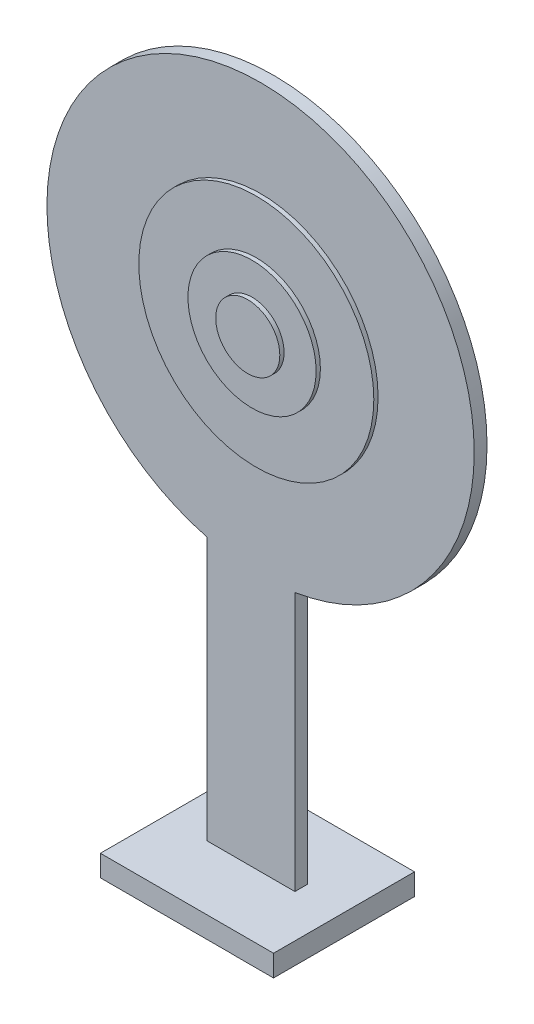
ISO-10303-21;
HEADER;
FILE_DESCRIPTION(('STEP AP214'),'2;1');
FILE_NAME('part.step','',(''),(''),'','','');
FILE_SCHEMA(('AUTOMOTIVE_DESIGN { 1 0 10303 214 1 1 1 1 }'));
ENDSEC;
DATA;
#1=APPLICATION_CONTEXT('core data for automotive mechanical design processes');
#2=APPLICATION_PROTOCOL_DEFINITION('international standard','automotive_design',2000,#1);
#3=PRODUCT_CONTEXT('',#1,'mechanical');
#4=PRODUCT('Part','Part','',(#3));
#5=PRODUCT_RELATED_PRODUCT_CATEGORY('part','',(#4));
#6=PRODUCT_DEFINITION_FORMATION('','',#4);
#7=PRODUCT_DEFINITION_CONTEXT('part definition',#1,'design');
#8=PRODUCT_DEFINITION('design','',#6,#7);
#9=PRODUCT_DEFINITION_SHAPE('','',#8);
#10=(LENGTH_UNIT() NAMED_UNIT(*) SI_UNIT(.MILLI.,.METRE.));
#11=(NAMED_UNIT(*) PLANE_ANGLE_UNIT() SI_UNIT($,.RADIAN.));
#12=(NAMED_UNIT(*) SI_UNIT($,.STERADIAN.) SOLID_ANGLE_UNIT());
#13=UNCERTAINTY_MEASURE_WITH_UNIT(LENGTH_MEASURE(1.E-05),#10,'distance_accuracy_value','');
#14=(GEOMETRIC_REPRESENTATION_CONTEXT(3) GLOBAL_UNCERTAINTY_ASSIGNED_CONTEXT((#13)) GLOBAL_UNIT_ASSIGNED_CONTEXT((#10,
#11,#12)) REPRESENTATION_CONTEXT('',''));
#15=CARTESIAN_POINT('',(0.,0.,0.));
#16=DIRECTION('',(0.,0.,1.));
#17=DIRECTION('',(1.,0.,0.));
#18=AXIS2_PLACEMENT_3D('',#15,#16,#17);
#19=CARTESIAN_POINT('',(-12.4918570683324,0.,0.));
#20=DIRECTION('',(1.,0.,0.));
#21=DIRECTION('',(0.,0.,-1.));
#22=AXIS2_PLACEMENT_3D('',#19,#20,#21);
#23=PLANE('',#22);
#24=DIRECTION('',(0.,0.,1.));
#25=VECTOR('',#24,1.);
#26=CARTESIAN_POINT('',(-12.4918570683324,-114.948734013118,-15.));
#27=LINE('',#26,#25);
#28=CARTESIAN_POINT('',(-12.4918570683324,-114.948734013118,-15.));
#29=VERTEX_POINT('',#28);
#30=CARTESIAN_POINT('',(-12.4918570683324,-114.948734013118,0.));
#31=VERTEX_POINT('',#30);
#32=EDGE_CURVE('E582',#29,#31,#27,.T.);
#33=ORIENTED_EDGE('',*,*,#32,.F.);
#34=DIRECTION('',(0.,1.,0.));
#35=VECTOR('',#34,1.);
#36=CARTESIAN_POINT('',(-12.4918570683324,-114.96458114681,-15.));
#37=LINE('',#36,#35);
#38=CARTESIAN_POINT('',(-12.4918570683324,-114.96458114681,-15.));
#39=VERTEX_POINT('',#38);
#40=EDGE_CURVE('E183',#39,#29,#37,.T.);
#41=ORIENTED_EDGE('',*,*,#40,.F.);
#42=DIRECTION('',(0.,0.,-1.));
#43=VECTOR('',#42,1.);
#44=CARTESIAN_POINT('',(-12.4918570683324,-114.96458114681,0.));
#45=LINE('',#44,#43);
#46=CARTESIAN_POINT('',(-12.4918570683324,-114.96458114681,0.));
#47=VERTEX_POINT('',#46);
#48=EDGE_CURVE('E240',#47,#39,#45,.T.);
#49=ORIENTED_EDGE('',*,*,#48,.F.);
#50=DIRECTION('',(0.,-1.,0.));
#51=VECTOR('',#50,1.);
#52=CARTESIAN_POINT('',(-12.4918570683324,-114.96458114681,0.));
#53=LINE('',#52,#51);
#54=EDGE_CURVE('E244',#31,#47,#53,.T.);
#55=ORIENTED_EDGE('',*,*,#54,.F.);
#56=EDGE_LOOP('',(#33,#41,#49,#55));
#57=FACE_BOUND('',#56,.T.);
#58=ADVANCED_FACE('F39',(#57),#23,.F.);
#59=CARTESIAN_POINT('',(-12.5218570683324,-114.96458114681,3.));
#60=DIRECTION('',(0.,0.,-1.));
#61=DIRECTION('',(0.,1.,0.));
#62=AXIS2_PLACEMENT_3D('',#59,#60,#61);
#63=PLANE('',#62);
#64=DIRECTION('',(0.,1.,0.));
#65=VECTOR('',#64,1.);
#66=CARTESIAN_POINT('',(-12.5218570683324,-114.96458114681,3.));
#67=LINE('',#66,#65);
#68=CARTESIAN_POINT('',(-12.5218570683324,-114.96458114681,3.));
#69=VERTEX_POINT('',#68);
#70=CARTESIAN_POINT('',(-12.5218570683324,-114.948734013118,3.));
#71=VERTEX_POINT('',#70);
#72=EDGE_CURVE('E223',#69,#71,#67,.T.);
#73=ORIENTED_EDGE('',*,*,#72,.T.);
#74=DIRECTION('',(1.,0.,0.));
#75=VECTOR('',#74,1.);
#76=CARTESIAN_POINT('',(-12.5218570683324,-114.948734013118,3.));
#77=LINE('',#76,#75);
#78=CARTESIAN_POINT('',(-12.4918570683324,-114.948734013118,3.));
#79=VERTEX_POINT('',#78);
#80=EDGE_CURVE('E184',#71,#79,#77,.T.);
#81=ORIENTED_EDGE('',*,*,#80,.T.);
#82=DIRECTION('',(0.,1.,0.));
#83=VECTOR('',#82,1.);
#84=CARTESIAN_POINT('',(-12.4918570683324,-114.96458114681,3.));
#85=LINE('',#84,#83);
#86=CARTESIAN_POINT('',(-12.4918570683324,-109.96458114681,3.));
#87=VERTEX_POINT('',#86);
#88=EDGE_CURVE('E187',#79,#87,#85,.T.);
#89=ORIENTED_EDGE('',*,*,#88,.T.);
#90=DIRECTION('',(1.,0.,0.));
#91=VECTOR('',#90,1.);
#92=CARTESIAN_POINT('',(-12.5218570683324,-109.96458114681,3.));
#93=LINE('',#92,#91);
#94=CARTESIAN_POINT('',(-12.4911301481857,-109.96458114681,3.));
#95=VERTEX_POINT('',#94);
#96=EDGE_CURVE('E54',#87,#95,#93,.T.);
#97=ORIENTED_EDGE('',*,*,#96,.T.);
#98=DIRECTION('',(0.,1.,0.));
#99=VECTOR('',#98,1.);
#100=CARTESIAN_POINT('',(-12.4911301481857,-48.4145811468104,2.99999999999999));
#101=LINE('',#100,#99);
#102=CARTESIAN_POINT('',(-12.4911301481857,-114.96458114681,3.));
#103=VERTEX_POINT('',#102);
#104=EDGE_CURVE('E232',#103,#95,#101,.T.);
#105=ORIENTED_EDGE('',*,*,#104,.F.);
#106=DIRECTION('',(1.,0.,0.));
#107=VECTOR('',#106,1.);
#108=CARTESIAN_POINT('',(-12.5218570683324,-114.96458114681,3.));
#109=LINE('',#108,#107);
#110=EDGE_CURVE('E228',#69,#103,#109,.T.);
#111=ORIENTED_EDGE('',*,*,#110,.F.);
#112=EDGE_LOOP('',(#73,#81,#89,#97,#105,#111));
#113=FACE_BOUND('',#112,.T.);
#114=ADVANCED_FACE('F327',(#113),#63,.T.);
#115=CARTESIAN_POINT('',(-12.5218570683324,0.,0.));
#116=DIRECTION('',(-1.,0.,0.));
#117=DIRECTION('',(0.,0.,1.));
#118=AXIS2_PLACEMENT_3D('',#115,#116,#117);
#119=PLANE('',#118);
#120=DIRECTION('',(0.,-1.,0.));
#121=VECTOR('',#120,1.);
#122=CARTESIAN_POINT('',(-12.5218570683324,-114.96458114681,18.));
#123=LINE('',#122,#121);
#124=CARTESIAN_POINT('',(-12.5218570683324,-114.948734013118,18.));
#125=VERTEX_POINT('',#124);
#126=CARTESIAN_POINT('',(-12.5218570683324,-114.96458114681,18.));
#127=VERTEX_POINT('',#126);
#128=EDGE_CURVE('E226',#125,#127,#123,.T.);
#129=ORIENTED_EDGE('',*,*,#128,.F.);
#130=DIRECTION('',(0.,0.,-1.));
#131=VECTOR('',#130,1.);
#132=CARTESIAN_POINT('',(-12.5218570683324,-114.948734013118,0.));
#133=LINE('',#132,#131);
#134=EDGE_CURVE('E11',#125,#71,#133,.T.);
#135=ORIENTED_EDGE('',*,*,#134,.T.);
#136=ORIENTED_EDGE('',*,*,#72,.F.);
#137=DIRECTION('',(0.,0.,-1.));
#138=VECTOR('',#137,1.);
#139=CARTESIAN_POINT('',(-12.5218570683324,-114.96458114681,3.));
#140=LINE('',#139,#138);
#141=EDGE_CURVE('E220',#127,#69,#140,.T.);
#142=ORIENTED_EDGE('',*,*,#141,.F.);
#143=EDGE_LOOP('',(#129,#135,#136,#142));
#144=FACE_BOUND('',#143,.T.);
#145=ADVANCED_FACE('F320',(#144),#119,.T.);
#146=CARTESIAN_POINT('',(8.02814293166765,-114.96458114681,3.));
#147=DIRECTION('',(-1.,0.,0.));
#148=DIRECTION('',(0.,0.,1.));
#149=AXIS2_PLACEMENT_3D('',#146,#147,#148);
#150=PLANE('',#149);
#151=DIRECTION('',(0.,0.,1.));
#152=VECTOR('',#151,1.);
#153=CARTESIAN_POINT('',(8.02814293166765,-109.96458114681,18.));
#154=LINE('',#153,#152);
#155=CARTESIAN_POINT('',(8.02814293166765,-109.96458114681,0.));
#156=VERTEX_POINT('',#155);
#157=CARTESIAN_POINT('',(8.02814293166765,-109.96458114681,3.));
#158=VERTEX_POINT('',#157);
#159=EDGE_CURVE('E198',#156,#158,#154,.T.);
#160=ORIENTED_EDGE('',*,*,#159,.F.);
#161=DIRECTION('',(0.,1.,0.));
#162=VECTOR('',#161,1.);
#163=CARTESIAN_POINT('',(8.02814293166765,-114.96458114681,0.));
#164=LINE('',#163,#162);
#165=CARTESIAN_POINT('',(8.02814293166765,-49.35128084527,0.));
#166=VERTEX_POINT('',#165);
#167=EDGE_CURVE('E263',#156,#166,#164,.T.);
#168=ORIENTED_EDGE('',*,*,#167,.T.);
#169=DIRECTION('',(0.,0.,-1.));
#170=VECTOR('',#169,1.);
#171=CARTESIAN_POINT('',(8.02814293166765,-49.35128084527,3.));
#172=LINE('',#171,#170);
#173=CARTESIAN_POINT('',(8.02814293166765,-49.35128084527,3.));
#174=VERTEX_POINT('',#173);
#175=EDGE_CURVE('E265',#174,#166,#172,.T.);
#176=ORIENTED_EDGE('',*,*,#175,.F.);
#177=DIRECTION('',(0.,1.,0.));
#178=VECTOR('',#177,1.);
#179=CARTESIAN_POINT('',(8.02814293166765,-114.96458114681,3.));
#180=LINE('',#179,#178);
#181=EDGE_CURVE('E262',#158,#174,#180,.T.);
#182=ORIENTED_EDGE('',*,*,#181,.F.);
#183=EDGE_LOOP('',(#160,#168,#176,#182));
#184=FACE_BOUND('',#183,.T.);
#185=ADVANCED_FACE('F318',(#184),#150,.F.);
#186=CARTESIAN_POINT('',(0.,0.,0.));
#187=DIRECTION('',(0.,0.,1.));
#188=DIRECTION('',(1.,0.,0.));
#189=AXIS2_PLACEMENT_3D('',#186,#187,#188);
#190=PLANE('',#189);
#191=DIRECTION('',(1.,0.,0.));
#192=VECTOR('',#191,1.);
#193=CARTESIAN_POINT('',(-12.4918570683324,-109.96458114681,0.));
#194=LINE('',#193,#192);
#195=CARTESIAN_POINT('',(-12.4911301481857,-109.96458114681,0.));
#196=VERTEX_POINT('',#195);
#197=EDGE_CURVE('E47',#196,#156,#194,.T.);
#198=ORIENTED_EDGE('',*,*,#197,.F.);
#199=DIRECTION('',(0.,-1.,0.));
#200=VECTOR('',#199,1.);
#201=CARTESIAN_POINT('',(-12.4911301481857,-48.4145811468104,0.));
#202=LINE('',#201,#200);
#203=CARTESIAN_POINT('',(-12.4911301481857,-48.4145811468104,0.));
#204=VERTEX_POINT('',#203);
#205=EDGE_CURVE('E266',#204,#196,#202,.T.);
#206=ORIENTED_EDGE('',*,*,#205,.F.);
#207=CARTESIAN_POINT('',(0.,0.,0.));
#208=DIRECTION('',(0.,0.,1.));
#209=DIRECTION('',(1.,0.,0.));
#210=AXIS2_PLACEMENT_3D('',#207,#208,#209);
#211=CIRCLE('',#210,50.);
#212=EDGE_CURVE('E296',#166,#204,#211,.T.);
#213=ORIENTED_EDGE('',*,*,#212,.F.);
#214=ORIENTED_EDGE('',*,*,#167,.F.);
#215=EDGE_LOOP('',(#198,#206,#213,#214));
#216=FACE_BOUND('',#215,.T.);
#217=ADVANCED_FACE('F305',(#216),#190,.F.);
#218=CARTESIAN_POINT('',(0.,0.,3.));
#219=DIRECTION('',(0.,0.,-1.));
#220=DIRECTION('',(-1.,0.,0.));
#221=AXIS2_PLACEMENT_3D('',#218,#219,#220);
#222=CYLINDRICAL_SURFACE('',#221,50.);
#223=DIRECTION('',(0.,0.,-1.));
#224=VECTOR('',#223,1.);
#225=CARTESIAN_POINT('',(-12.4911301481857,-48.4145811468104,3.));
#226=LINE('',#225,#224);
#227=CARTESIAN_POINT('',(-12.4911301481857,-48.4145811468104,3.));
#228=VERTEX_POINT('',#227);
#229=EDGE_CURVE('E277',#228,#204,#226,.T.);
#230=ORIENTED_EDGE('',*,*,#229,.F.);
#231=CARTESIAN_POINT('',(0.,0.,3.));
#232=DIRECTION('',(0.,0.,1.));
#233=DIRECTION('',(1.,0.,0.));
#234=AXIS2_PLACEMENT_3D('',#231,#232,#233);
#235=CIRCLE('',#234,50.);
#236=EDGE_CURVE('E299',#174,#228,#235,.T.);
#237=ORIENTED_EDGE('',*,*,#236,.F.);
#238=ORIENTED_EDGE('',*,*,#175,.T.);
#239=ORIENTED_EDGE('',*,*,#212,.T.);
#240=EDGE_LOOP('',(#230,#237,#238,#239));
#241=FACE_BOUND('',#240,.T.);
#242=ADVANCED_FACE('F41',(#241),#222,.T.);
#243=CARTESIAN_POINT('',(0.,0.,3.));
#244=DIRECTION('',(0.,0.,1.));
#245=DIRECTION('',(1.,0.,0.));
#246=AXIS2_PLACEMENT_3D('',#243,#244,#245);
#247=PLANE('',#246);
#248=EDGE_CURVE('E236',#95,#158,#93,.T.);
#249=ORIENTED_EDGE('',*,*,#248,.T.);
#250=ORIENTED_EDGE('',*,*,#181,.T.);
#251=ORIENTED_EDGE('',*,*,#236,.T.);
#252=DIRECTION('',(0.,-1.,0.));
#253=VECTOR('',#252,1.);
#254=CARTESIAN_POINT('',(-12.4911301481857,-48.4145811468104,3.));
#255=LINE('',#254,#253);
#256=EDGE_CURVE('E259',#228,#95,#255,.T.);
#257=ORIENTED_EDGE('',*,*,#256,.T.);
#258=EDGE_LOOP('',(#249,#250,#251,#257));
#259=FACE_BOUND('',#258,.T.);
#260=CARTESIAN_POINT('',(0.,0.,3.));
#261=DIRECTION('',(0.,0.,1.));
#262=DIRECTION('',(1.,0.,0.));
#263=AXIS2_PLACEMENT_3D('',#260,#261,#262);
#264=CIRCLE('',#263,27.5);
#265=CARTESIAN_POINT('',(27.5,0.,3.));
#266=VERTEX_POINT('',#265);
#267=EDGE_CURVE('E293',#266,#266,#264,.T.);
#268=ORIENTED_EDGE('',*,*,#267,.F.);
#269=EDGE_LOOP('',(#268));
#270=FACE_BOUND('',#269,.T.);
#271=ADVANCED_FACE('F313',(#259,#270),#247,.T.);
#272=CARTESIAN_POINT('',(0.,0.,4.));
#273=DIRECTION('',(0.,0.,-1.));
#274=DIRECTION('',(-1.,0.,0.));
#275=AXIS2_PLACEMENT_3D('',#272,#273,#274);
#276=CYLINDRICAL_SURFACE('',#275,27.5);
#277=CARTESIAN_POINT('',(0.,0.,4.));
#278=DIRECTION('',(0.,0.,1.));
#279=DIRECTION('',(1.,0.,0.));
#280=AXIS2_PLACEMENT_3D('',#277,#278,#279);
#281=CIRCLE('',#280,27.5);
#282=CARTESIAN_POINT('',(27.5,0.,4.));
#283=VERTEX_POINT('',#282);
#284=EDGE_CURVE('E290',#283,#283,#281,.T.);
#285=ORIENTED_EDGE('',*,*,#284,.F.);
#286=EDGE_LOOP('',(#285));
#287=FACE_BOUND('',#286,.T.);
#288=ORIENTED_EDGE('',*,*,#267,.T.);
#289=EDGE_LOOP('',(#288));
#290=FACE_BOUND('',#289,.T.);
#291=ADVANCED_FACE('F528',(#287,#290),#276,.T.);
#292=CARTESIAN_POINT('',(0.,0.,4.));
#293=DIRECTION('',(0.,0.,1.));
#294=DIRECTION('',(1.,0.,0.));
#295=AXIS2_PLACEMENT_3D('',#292,#293,#294);
#296=PLANE('',#295);
#297=CARTESIAN_POINT('',(0.,0.,4.));
#298=DIRECTION('',(0.,0.,1.));
#299=DIRECTION('',(1.,0.,0.));
#300=AXIS2_PLACEMENT_3D('',#297,#298,#299);
#301=CIRCLE('',#300,15.);
#302=CARTESIAN_POINT('',(15.,0.,4.));
#303=VERTEX_POINT('',#302);
#304=EDGE_CURVE('E287',#303,#303,#301,.T.);
#305=ORIENTED_EDGE('',*,*,#304,.F.);
#306=EDGE_LOOP('',(#305));
#307=FACE_BOUND('',#306,.T.);
#308=ORIENTED_EDGE('',*,*,#284,.T.);
#309=EDGE_LOOP('',(#308));
#310=FACE_BOUND('',#309,.T.);
#311=ADVANCED_FACE('F519',(#307,#310),#296,.T.);
#312=CARTESIAN_POINT('',(0.,0.,5.));
#313=DIRECTION('',(0.,0.,-1.));
#314=DIRECTION('',(-1.,0.,0.));
#315=AXIS2_PLACEMENT_3D('',#312,#313,#314);
#316=CYLINDRICAL_SURFACE('',#315,15.);
#317=CARTESIAN_POINT('',(0.,0.,5.));
#318=DIRECTION('',(0.,0.,1.));
#319=DIRECTION('',(1.,0.,0.));
#320=AXIS2_PLACEMENT_3D('',#317,#318,#319);
#321=CIRCLE('',#320,15.);
#322=CARTESIAN_POINT('',(15.,0.,5.));
#323=VERTEX_POINT('',#322);
#324=EDGE_CURVE('E283',#323,#323,#321,.T.);
#325=ORIENTED_EDGE('',*,*,#324,.F.);
#326=EDGE_LOOP('',(#325));
#327=FACE_BOUND('',#326,.T.);
#328=ORIENTED_EDGE('',*,*,#304,.T.);
#329=EDGE_LOOP('',(#328));
#330=FACE_BOUND('',#329,.T.);
#331=ADVANCED_FACE('F510',(#327,#330),#316,.T.);
#332=CARTESIAN_POINT('',(0.,0.,5.));
#333=DIRECTION('',(0.,0.,1.));
#334=DIRECTION('',(1.,0.,0.));
#335=AXIS2_PLACEMENT_3D('',#332,#333,#334);
#336=PLANE('',#335);
#337=CARTESIAN_POINT('',(0.,0.,5.));
#338=DIRECTION('',(0.,0.,1.));
#339=DIRECTION('',(1.,0.,0.));
#340=AXIS2_PLACEMENT_3D('',#337,#338,#339);
#341=CIRCLE('',#340,7.5);
#342=CARTESIAN_POINT('',(7.5,0.,5.));
#343=VERTEX_POINT('',#342);
#344=EDGE_CURVE('E284',#343,#343,#341,.T.);
#345=ORIENTED_EDGE('',*,*,#344,.F.);
#346=EDGE_LOOP('',(#345));
#347=FACE_BOUND('',#346,.T.);
#348=ORIENTED_EDGE('',*,*,#324,.T.);
#349=EDGE_LOOP('',(#348));
#350=FACE_BOUND('',#349,.T.);
#351=ADVANCED_FACE('F501',(#347,#350),#336,.T.);
#352=CARTESIAN_POINT('',(0.,0.,6.));
#353=DIRECTION('',(0.,0.,-1.));
#354=DIRECTION('',(-1.,0.,0.));
#355=AXIS2_PLACEMENT_3D('',#352,#353,#354);
#356=CYLINDRICAL_SURFACE('',#355,7.5);
#357=CARTESIAN_POINT('',(0.,0.,6.));
#358=DIRECTION('',(0.,0.,1.));
#359=DIRECTION('',(1.,0.,0.));
#360=AXIS2_PLACEMENT_3D('',#357,#358,#359);
#361=CIRCLE('',#360,7.5);
#362=CARTESIAN_POINT('',(7.5,0.,6.));
#363=VERTEX_POINT('',#362);
#364=EDGE_CURVE('E280',#363,#363,#361,.T.);
#365=ORIENTED_EDGE('',*,*,#364,.F.);
#366=EDGE_LOOP('',(#365));
#367=FACE_BOUND('',#366,.T.);
#368=ORIENTED_EDGE('',*,*,#344,.T.);
#369=EDGE_LOOP('',(#368));
#370=FACE_BOUND('',#369,.T.);
#371=ADVANCED_FACE('F492',(#367,#370),#356,.T.);
#372=CARTESIAN_POINT('',(0.,0.,6.));
#373=DIRECTION('',(0.,0.,1.));
#374=DIRECTION('',(1.,0.,0.));
#375=AXIS2_PLACEMENT_3D('',#372,#373,#374);
#376=PLANE('',#375);
#377=ORIENTED_EDGE('',*,*,#364,.T.);
#378=EDGE_LOOP('',(#377));
#379=FACE_BOUND('',#378,.T.);
#380=ADVANCED_FACE('F476',(#379),#376,.T.);
#381=CARTESIAN_POINT('',(-12.4911301481857,-48.4145811468104,3.));
#382=DIRECTION('',(1.,0.,0.));
#383=DIRECTION('',(0.,1.,0.));
#384=AXIS2_PLACEMENT_3D('',#381,#382,#383);
#385=PLANE('',#384);
#386=ORIENTED_EDGE('',*,*,#205,.T.);
#387=CARTESIAN_POINT('',(-12.4911301481857,-114.96458114681,0.));
#388=VERTEX_POINT('',#387);
#389=EDGE_CURVE('E252',#196,#388,#202,.T.);
#390=ORIENTED_EDGE('',*,*,#389,.T.);
#391=DIRECTION('',(0.,0.,-1.));
#392=VECTOR('',#391,1.);
#393=CARTESIAN_POINT('',(-12.4911301481857,-114.96458114681,3.));
#394=LINE('',#393,#392);
#395=EDGE_CURVE('E274',#103,#388,#394,.T.);
#396=ORIENTED_EDGE('',*,*,#395,.F.);
#397=ORIENTED_EDGE('',*,*,#104,.T.);
#398=ORIENTED_EDGE('',*,*,#256,.F.);
#399=ORIENTED_EDGE('',*,*,#229,.T.);
#400=EDGE_LOOP('',(#386,#390,#396,#397,#398,#399));
#401=FACE_BOUND('',#400,.T.);
#402=ADVANCED_FACE('F309',(#401),#385,.F.);
#403=CARTESIAN_POINT('',(-12.4911301481857,-114.96458114681,3.));
#404=DIRECTION('',(0.,1.,0.));
#405=DIRECTION('',(0.,0.,1.));
#406=AXIS2_PLACEMENT_3D('',#403,#404,#405);
#407=PLANE('',#406);
#408=ORIENTED_EDGE('',*,*,#395,.T.);
#409=DIRECTION('',(1.,0.,0.));
#410=VECTOR('',#409,1.);
#411=CARTESIAN_POINT('',(-12.4918570683324,-114.96458114681,0.));
#412=LINE('',#411,#410);
#413=EDGE_CURVE('E249',#47,#388,#412,.T.);
#414=ORIENTED_EDGE('',*,*,#413,.F.);
#415=ORIENTED_EDGE('',*,*,#48,.T.);
#416=DIRECTION('',(1.,0.,0.));
#417=VECTOR('',#416,1.);
#418=CARTESIAN_POINT('',(-12.4918570683324,-114.96458114681,-15.));
#419=LINE('',#418,#417);
#420=CARTESIAN_POINT('',(8.02814293166765,-114.96458114681,-15.));
#421=VERTEX_POINT('',#420);
#422=EDGE_CURVE('E248',#39,#421,#419,.T.);
#423=ORIENTED_EDGE('',*,*,#422,.T.);
#424=DIRECTION('',(0.,0.,-1.));
#425=VECTOR('',#424,1.);
#426=CARTESIAN_POINT('',(8.02814293166765,-114.96458114681,3.));
#427=LINE('',#426,#425);
#428=CARTESIAN_POINT('',(8.02814293166765,-114.96458114681,18.));
#429=VERTEX_POINT('',#428);
#430=EDGE_CURVE('E271',#429,#421,#427,.T.);
#431=ORIENTED_EDGE('',*,*,#430,.F.);
#432=DIRECTION('',(1.,0.,0.));
#433=VECTOR('',#432,1.);
#434=CARTESIAN_POINT('',(-12.5218570683324,-114.96458114681,18.));
#435=LINE('',#434,#433);
#436=EDGE_CURVE('E229',#127,#429,#435,.T.);
#437=ORIENTED_EDGE('',*,*,#436,.F.);
#438=ORIENTED_EDGE('',*,*,#141,.T.);
#439=ORIENTED_EDGE('',*,*,#110,.T.);
#440=EDGE_LOOP('',(#408,#414,#415,#423,#431,#437,#438,#439));
#441=FACE_BOUND('',#440,.T.);
#442=ADVANCED_FACE('F345',(#441),#407,.F.);
#443=CARTESIAN_POINT('',(-12.4918570683324,-114.96458114681,0.));
#444=DIRECTION('',(0.,0.,1.));
#445=DIRECTION('',(1.,0.,0.));
#446=AXIS2_PLACEMENT_3D('',#443,#444,#445);
#447=PLANE('',#446);
#448=ORIENTED_EDGE('',*,*,#389,.F.);
#449=CARTESIAN_POINT('',(-12.4918570683324,-109.96458114681,0.));
#450=VERTEX_POINT('',#449);
#451=EDGE_CURVE('E253',#450,#196,#194,.T.);
#452=ORIENTED_EDGE('',*,*,#451,.F.);
#453=EDGE_CURVE('E245',#450,#31,#53,.T.);
#454=ORIENTED_EDGE('',*,*,#453,.T.);
#455=ORIENTED_EDGE('',*,*,#54,.T.);
#456=ORIENTED_EDGE('',*,*,#413,.T.);
#457=EDGE_LOOP('',(#448,#452,#454,#455,#456));
#458=FACE_BOUND('',#457,.T.);
#459=ADVANCED_FACE('F342',(#458),#447,.T.);
#460=CARTESIAN_POINT('',(-12.4918570683324,-109.96458114681,0.));
#461=DIRECTION('',(0.,1.,0.));
#462=DIRECTION('',(0.,0.,1.));
#463=AXIS2_PLACEMENT_3D('',#460,#461,#462);
#464=PLANE('',#463);
#465=DIRECTION('',(1.,0.,0.));
#466=VECTOR('',#465,1.);
#467=CARTESIAN_POINT('',(-12.5218570683324,-109.96458114681,18.));
#468=LINE('',#467,#466);
#469=CARTESIAN_POINT('',(-22.4918570683324,-109.96458114681,18.));
#470=VERTEX_POINT('',#469);
#471=CARTESIAN_POINT('',(18.0281429316676,-109.96458114681,18.));
#472=VERTEX_POINT('',#471);
#473=EDGE_CURVE('E233',#470,#472,#468,.T.);
#474=ORIENTED_EDGE('',*,*,#473,.T.);
#475=DIRECTION('',(0.,0.,1.));
#476=VECTOR('',#475,1.);
#477=CARTESIAN_POINT('',(18.0281429316676,-109.96458114681,18.));
#478=LINE('',#477,#476);
#479=CARTESIAN_POINT('',(18.0281429316676,-109.96458114681,-15.));
#480=VERTEX_POINT('',#479);
#481=EDGE_CURVE('E203',#480,#472,#478,.T.);
#482=ORIENTED_EDGE('',*,*,#481,.F.);
#483=DIRECTION('',(1.,0.,0.));
#484=VECTOR('',#483,1.);
#485=CARTESIAN_POINT('',(-12.4918570683324,-109.96458114681,-15.));
#486=LINE('',#485,#484);
#487=CARTESIAN_POINT('',(-22.4918570683324,-109.96458114681,-15.));
#488=VERTEX_POINT('',#487);
#489=EDGE_CURVE('E256',#488,#480,#486,.T.);
#490=ORIENTED_EDGE('',*,*,#489,.F.);
#491=DIRECTION('',(0.,0.,-1.));
#492=VECTOR('',#491,1.);
#493=CARTESIAN_POINT('',(-22.4918570683324,-109.96458114681,-15.));
#494=LINE('',#493,#492);
#495=EDGE_CURVE('E176',#470,#488,#494,.T.);
#496=ORIENTED_EDGE('',*,*,#495,.F.);
#497=EDGE_LOOP('',(#474,#482,#490,#496));
#498=FACE_BOUND('',#497,.T.);
#499=ORIENTED_EDGE('',*,*,#96,.F.);
#500=DIRECTION('',(0.,0.,-1.));
#501=VECTOR('',#500,1.);
#502=CARTESIAN_POINT('',(-12.4918570683324,-109.96458114681,-15.));
#503=LINE('',#502,#501);
#504=EDGE_CURVE('E178',#87,#450,#503,.T.);
#505=ORIENTED_EDGE('',*,*,#504,.T.);
#506=ORIENTED_EDGE('',*,*,#451,.T.);
#507=ORIENTED_EDGE('',*,*,#197,.T.);
#508=ORIENTED_EDGE('',*,*,#159,.T.);
#509=ORIENTED_EDGE('',*,*,#248,.F.);
#510=EDGE_LOOP('',(#499,#505,#506,#507,#508,#509));
#511=FACE_BOUND('',#510,.T.);
#512=ADVANCED_FACE('F316',(#498,#511),#464,.T.);
#513=CARTESIAN_POINT('',(-12.4918570683324,-114.96458114681,-15.));
#514=DIRECTION('',(0.,0.,-1.));
#515=DIRECTION('',(-1.,0.,0.));
#516=AXIS2_PLACEMENT_3D('',#513,#514,#515);
#517=PLANE('',#516);
#518=ORIENTED_EDGE('',*,*,#489,.T.);
#519=DIRECTION('',(0.,1.,0.));
#520=VECTOR('',#519,1.);
#521=CARTESIAN_POINT('',(18.0281429316676,-109.96458114681,-15.));
#522=LINE('',#521,#520);
#523=CARTESIAN_POINT('',(18.0281429316676,-114.987555224255,-15.));
#524=VERTEX_POINT('',#523);
#525=EDGE_CURVE('E200',#524,#480,#522,.T.);
#526=ORIENTED_EDGE('',*,*,#525,.F.);
#527=DIRECTION('',(-1.,0.,0.));
#528=VECTOR('',#527,1.);
#529=CARTESIAN_POINT('',(18.0281429316676,-114.987555224255,-15.));
#530=LINE('',#529,#528);
#531=CARTESIAN_POINT('',(8.02814293166765,-114.987555224255,-15.));
#532=VERTEX_POINT('',#531);
#533=EDGE_CURVE('E206',#524,#532,#530,.T.);
#534=ORIENTED_EDGE('',*,*,#533,.T.);
#535=DIRECTION('',(0.,1.,0.));
#536=VECTOR('',#535,1.);
#537=CARTESIAN_POINT('',(8.02814293166765,-109.96458114681,-15.));
#538=LINE('',#537,#536);
#539=EDGE_CURVE('E210',#532,#421,#538,.T.);
#540=ORIENTED_EDGE('',*,*,#539,.T.);
#541=ORIENTED_EDGE('',*,*,#422,.F.);
#542=ORIENTED_EDGE('',*,*,#40,.T.);
#543=DIRECTION('',(1.,0.,0.));
#544=VECTOR('',#543,1.);
#545=CARTESIAN_POINT('',(-22.4918570683324,-114.948734013118,-15.));
#546=LINE('',#545,#544);
#547=CARTESIAN_POINT('',(-22.4918570683324,-114.948734013118,-15.));
#548=VERTEX_POINT('',#547);
#549=EDGE_CURVE('E162',#548,#29,#546,.T.);
#550=ORIENTED_EDGE('',*,*,#549,.F.);
#551=DIRECTION('',(0.,-1.,0.));
#552=VECTOR('',#551,1.);
#553=CARTESIAN_POINT('',(-22.4918570683324,-109.96458114681,-15.));
#554=LINE('',#553,#552);
#555=EDGE_CURVE('E170',#488,#548,#554,.T.);
#556=ORIENTED_EDGE('',*,*,#555,.F.);
#557=EDGE_LOOP('',(#518,#526,#534,#540,#541,#542,#550,#556));
#558=FACE_BOUND('',#557,.T.);
#559=ADVANCED_FACE('F181',(#558),#517,.T.);
#560=CARTESIAN_POINT('',(-12.5218570683324,-114.96458114681,18.));
#561=DIRECTION('',(0.,0.,1.));
#562=DIRECTION('',(1.,0.,0.));
#563=AXIS2_PLACEMENT_3D('',#560,#561,#562);
#564=PLANE('',#563);
#565=DIRECTION('',(1.,0.,0.));
#566=VECTOR('',#565,1.);
#567=CARTESIAN_POINT('',(-22.4918570683324,-114.948734013118,18.));
#568=LINE('',#567,#566);
#569=CARTESIAN_POINT('',(-22.4918570683324,-114.948734013118,18.));
#570=VERTEX_POINT('',#569);
#571=EDGE_CURVE('E165',#570,#125,#568,.T.);
#572=ORIENTED_EDGE('',*,*,#571,.T.);
#573=ORIENTED_EDGE('',*,*,#128,.T.);
#574=ORIENTED_EDGE('',*,*,#436,.T.);
#575=DIRECTION('',(0.,-1.,0.));
#576=VECTOR('',#575,1.);
#577=CARTESIAN_POINT('',(8.02814293166765,-109.96458114681,18.));
#578=LINE('',#577,#576);
#579=CARTESIAN_POINT('',(8.02814293166765,-114.987555224255,18.));
#580=VERTEX_POINT('',#579);
#581=EDGE_CURVE('E193',#429,#580,#578,.T.);
#582=ORIENTED_EDGE('',*,*,#581,.T.);
#583=DIRECTION('',(-1.,0.,0.));
#584=VECTOR('',#583,1.);
#585=CARTESIAN_POINT('',(18.0281429316676,-114.987555224255,18.));
#586=LINE('',#585,#584);
#587=CARTESIAN_POINT('',(18.0281429316676,-114.987555224255,18.));
#588=VERTEX_POINT('',#587);
#589=EDGE_CURVE('E217',#588,#580,#586,.T.);
#590=ORIENTED_EDGE('',*,*,#589,.F.);
#591=DIRECTION('',(0.,-1.,0.));
#592=VECTOR('',#591,1.);
#593=CARTESIAN_POINT('',(18.0281429316676,-109.96458114681,18.));
#594=LINE('',#593,#592);
#595=EDGE_CURVE('E194',#472,#588,#594,.T.);
#596=ORIENTED_EDGE('',*,*,#595,.F.);
#597=ORIENTED_EDGE('',*,*,#473,.F.);
#598=DIRECTION('',(0.,1.,0.));
#599=VECTOR('',#598,1.);
#600=CARTESIAN_POINT('',(-22.4918570683324,-109.96458114681,18.));
#601=LINE('',#600,#599);
#602=EDGE_CURVE('E169',#570,#470,#601,.T.);
#603=ORIENTED_EDGE('',*,*,#602,.F.);
#604=EDGE_LOOP('',(#572,#573,#574,#582,#590,#596,#597,#603));
#605=FACE_BOUND('',#604,.T.);
#606=ADVANCED_FACE('F350',(#605),#564,.T.);
#607=CARTESIAN_POINT('',(8.02814293166765,0.,0.));
#608=DIRECTION('',(1.,0.,0.));
#609=DIRECTION('',(0.,0.,-1.));
#610=AXIS2_PLACEMENT_3D('',#607,#608,#609);
#611=PLANE('',#610);
#612=ORIENTED_EDGE('',*,*,#581,.F.);
#613=ORIENTED_EDGE('',*,*,#430,.T.);
#614=ORIENTED_EDGE('',*,*,#539,.F.);
#615=DIRECTION('',(0.,0.,-1.));
#616=VECTOR('',#615,1.);
#617=CARTESIAN_POINT('',(8.02814293166765,-114.987555224255,18.));
#618=LINE('',#617,#616);
#619=EDGE_CURVE('E208',#580,#532,#618,.T.);
#620=ORIENTED_EDGE('',*,*,#619,.F.);
#621=EDGE_LOOP('',(#612,#613,#614,#620));
#622=FACE_BOUND('',#621,.T.);
#623=ADVANCED_FACE('F354',(#622),#611,.F.);
#624=CARTESIAN_POINT('',(18.0281429316676,-114.987555224255,18.));
#625=DIRECTION('',(0.,1.,0.));
#626=DIRECTION('',(0.,0.,1.));
#627=AXIS2_PLACEMENT_3D('',#624,#625,#626);
#628=PLANE('',#627);
#629=ORIENTED_EDGE('',*,*,#619,.T.);
#630=ORIENTED_EDGE('',*,*,#533,.F.);
#631=DIRECTION('',(0.,0.,-1.));
#632=VECTOR('',#631,1.);
#633=CARTESIAN_POINT('',(18.0281429316676,-114.987555224255,18.));
#634=LINE('',#633,#632);
#635=EDGE_CURVE('E197',#588,#524,#634,.T.);
#636=ORIENTED_EDGE('',*,*,#635,.F.);
#637=ORIENTED_EDGE('',*,*,#589,.T.);
#638=EDGE_LOOP('',(#629,#630,#636,#637));
#639=FACE_BOUND('',#638,.T.);
#640=ADVANCED_FACE('F360',(#639),#628,.F.);
#641=CARTESIAN_POINT('',(18.0281429316676,0.,0.));
#642=DIRECTION('',(1.,0.,0.));
#643=DIRECTION('',(0.,0.,-1.));
#644=AXIS2_PLACEMENT_3D('',#641,#642,#643);
#645=PLANE('',#644);
#646=ORIENTED_EDGE('',*,*,#595,.T.);
#647=ORIENTED_EDGE('',*,*,#635,.T.);
#648=ORIENTED_EDGE('',*,*,#525,.T.);
#649=ORIENTED_EDGE('',*,*,#481,.T.);
#650=EDGE_LOOP('',(#646,#647,#648,#649));
#651=FACE_BOUND('',#650,.T.);
#652=ADVANCED_FACE('F365',(#651),#645,.T.);
#653=CARTESIAN_POINT('',(-22.4918570683324,-114.948734013118,-15.));
#654=DIRECTION('',(0.,1.,0.));
#655=DIRECTION('',(0.,0.,1.));
#656=AXIS2_PLACEMENT_3D('',#653,#654,#655);
#657=PLANE('',#656);
#658=ORIENTED_EDGE('',*,*,#80,.F.);
#659=ORIENTED_EDGE('',*,*,#134,.F.);
#660=ORIENTED_EDGE('',*,*,#571,.F.);
#661=DIRECTION('',(0.,0.,1.));
#662=VECTOR('',#661,1.);
#663=CARTESIAN_POINT('',(-22.4918570683324,-114.948734013118,-15.));
#664=LINE('',#663,#662);
#665=EDGE_CURVE('E157',#548,#570,#664,.T.);
#666=ORIENTED_EDGE('',*,*,#665,.F.);
#667=ORIENTED_EDGE('',*,*,#549,.T.);
#668=ORIENTED_EDGE('',*,*,#32,.T.);
#669=EDGE_CURVE('E595',#31,#79,#27,.T.);
#670=ORIENTED_EDGE('',*,*,#669,.T.);
#671=EDGE_LOOP('',(#658,#659,#660,#666,#667,#668,#670));
#672=FACE_BOUND('',#671,.T.);
#673=ADVANCED_FACE('F159',(#672),#657,.F.);
#674=CARTESIAN_POINT('',(-22.4918570683324,0.,0.));
#675=DIRECTION('',(-1.,0.,0.));
#676=DIRECTION('',(0.,0.,1.));
#677=AXIS2_PLACEMENT_3D('',#674,#675,#676);
#678=PLANE('',#677);
#679=ORIENTED_EDGE('',*,*,#555,.T.);
#680=ORIENTED_EDGE('',*,*,#665,.T.);
#681=ORIENTED_EDGE('',*,*,#602,.T.);
#682=ORIENTED_EDGE('',*,*,#495,.T.);
#683=EDGE_LOOP('',(#679,#680,#681,#682));
#684=FACE_BOUND('',#683,.T.);
#685=ADVANCED_FACE('F174',(#684),#678,.T.);
#686=CARTESIAN_POINT('',(-12.4918570683324,0.,0.));
#687=DIRECTION('',(-1.,0.,0.));
#688=DIRECTION('',(0.,0.,1.));
#689=AXIS2_PLACEMENT_3D('',#686,#687,#688);
#690=PLANE('',#689);
#691=ORIENTED_EDGE('',*,*,#453,.F.);
#692=ORIENTED_EDGE('',*,*,#504,.F.);
#693=ORIENTED_EDGE('',*,*,#88,.F.);
#694=ORIENTED_EDGE('',*,*,#669,.F.);
#695=EDGE_LOOP('',(#691,#692,#693,#694));
#696=FACE_BOUND('',#695,.T.);
#697=ADVANCED_FACE('F371',(#696),#690,.F.);
#698=CLOSED_SHELL('',(#58,#114,#145,#185,#217,#242,#271,#291,#311,#331,#351,#371,#380,#402,#442,
#459,#512,#559,#606,#623,#640,#652,#673,#685,#697));
#699=MANIFOLD_SOLID_BREP('B2',#698);
#700=ADVANCED_BREP_SHAPE_REPRESENTATION('',(#18,#699),#14);
#701=SHAPE_DEFINITION_REPRESENTATION(#9,#700);
ENDSEC;
END-ISO-10303-21;
